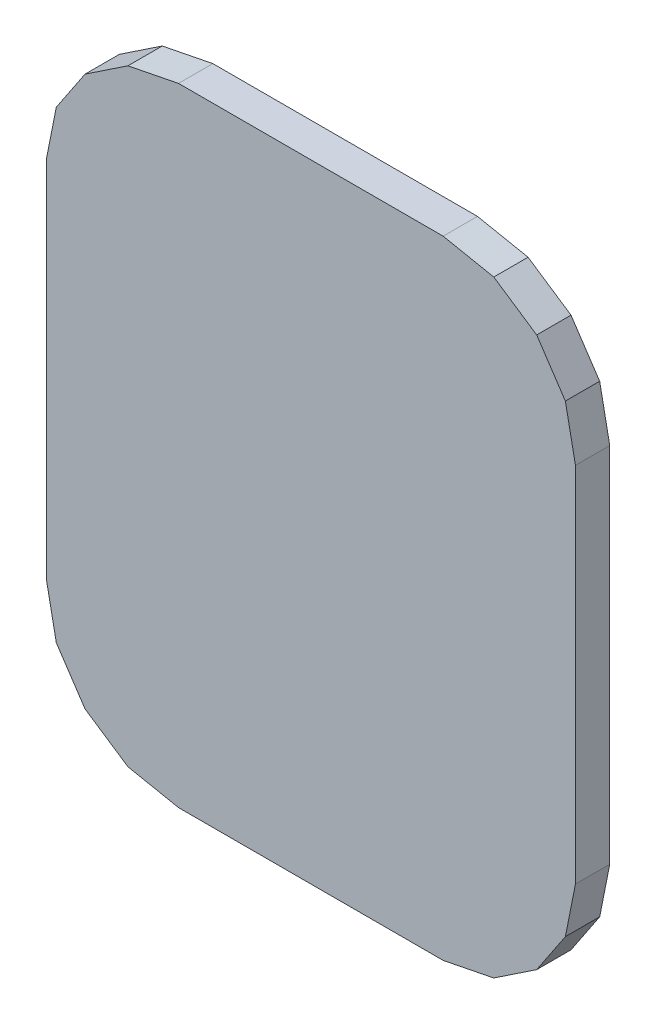
ISO-10303-21;
HEADER;
FILE_DESCRIPTION(('STEP AP214'),'2;1');
FILE_NAME('part.step','',(''),(''),'','','');
FILE_SCHEMA(('AUTOMOTIVE_DESIGN { 1 0 10303 214 1 1 1 1 }'));
ENDSEC;
DATA;
#1=APPLICATION_CONTEXT('core data for automotive mechanical design processes');
#2=APPLICATION_PROTOCOL_DEFINITION('international standard','automotive_design',2000,#1);
#3=PRODUCT_CONTEXT('',#1,'mechanical');
#4=PRODUCT('Part','Part','',(#3));
#5=PRODUCT_RELATED_PRODUCT_CATEGORY('part','',(#4));
#6=PRODUCT_DEFINITION_FORMATION('','',#4);
#7=PRODUCT_DEFINITION_CONTEXT('part definition',#1,'design');
#8=PRODUCT_DEFINITION('design','',#6,#7);
#9=PRODUCT_DEFINITION_SHAPE('','',#8);
#10=(LENGTH_UNIT() NAMED_UNIT(*) SI_UNIT(.MILLI.,.METRE.));
#11=(NAMED_UNIT(*) PLANE_ANGLE_UNIT() SI_UNIT($,.RADIAN.));
#12=(NAMED_UNIT(*) SI_UNIT($,.STERADIAN.) SOLID_ANGLE_UNIT());
#13=UNCERTAINTY_MEASURE_WITH_UNIT(LENGTH_MEASURE(1.E-05),#10,'distance_accuracy_value','');
#14=(GEOMETRIC_REPRESENTATION_CONTEXT(3) GLOBAL_UNCERTAINTY_ASSIGNED_CONTEXT((#13)) GLOBAL_UNIT_ASSIGNED_CONTEXT((#10,
#11,#12)) REPRESENTATION_CONTEXT('',''));
#15=CARTESIAN_POINT('',(0.,0.,0.));
#16=DIRECTION('',(0.,0.,1.));
#17=DIRECTION('',(1.,0.,0.));
#18=AXIS2_PLACEMENT_3D('',#15,#16,#17);
#19=CARTESIAN_POINT('',(95.61,-122.5,1.635));
#20=DIRECTION('',(0.,0.,-1.));
#21=DIRECTION('',(0.,-1.,0.));
#22=AXIS2_PLACEMENT_3D('',#19,#20,#21);
#23=PLANE('',#22);
#24=DIRECTION('',(0.980786045861535,-0.195086473757908,0.));
#25=VECTOR('',#24,1.);
#26=CARTESIAN_POINT('',(95.745,-122.18,1.635));
#27=LINE('',#26,#25);
#28=CARTESIAN_POINT('',(95.745,-122.18,1.635));
#29=VERTEX_POINT('',#28);
#30=CARTESIAN_POINT('',(95.796662,-122.190276,1.635));
#31=VERTEX_POINT('',#30);
#32=EDGE_CURVE('E25',#29,#31,#27,.T.);
#33=ORIENTED_EDGE('',*,*,#32,.F.);
#34=DIRECTION('',(1.,0.,0.));
#35=VECTOR('',#34,1.);
#36=CARTESIAN_POINT('',(95.475,-122.18,1.635));
#37=LINE('',#36,#35);
#38=CARTESIAN_POINT('',(95.475,-122.18,1.635));
#39=VERTEX_POINT('',#38);
#40=EDGE_CURVE('E306',#39,#29,#37,.T.);
#41=ORIENTED_EDGE('',*,*,#40,.F.);
#42=DIRECTION('',(0.980786045861535,0.195086473757908,0.));
#43=VECTOR('',#42,1.);
#44=CARTESIAN_POINT('',(95.423338,-122.190276,1.635));
#45=LINE('',#44,#43);
#46=CARTESIAN_POINT('',(95.423338,-122.190276,1.635));
#47=VERTEX_POINT('',#46);
#48=EDGE_CURVE('E374',#47,#39,#45,.T.);
#49=ORIENTED_EDGE('',*,*,#48,.F.);
#50=DIRECTION('',(0.831462770177597,0.555580472846731,0.));
#51=VECTOR('',#50,1.);
#52=CARTESIAN_POINT('',(95.379541,-122.219541,1.635));
#53=LINE('',#52,#51);
#54=CARTESIAN_POINT('',(95.379541,-122.219541,1.635));
#55=VERTEX_POINT('',#54);
#56=EDGE_CURVE('E308',#55,#47,#53,.T.);
#57=ORIENTED_EDGE('',*,*,#56,.F.);
#58=DIRECTION('',(0.555580472846731,0.831462770177597,0.));
#59=VECTOR('',#58,1.);
#60=CARTESIAN_POINT('',(95.350276,-122.263338,1.635));
#61=LINE('',#60,#59);
#62=CARTESIAN_POINT('',(95.350276,-122.263338,1.635));
#63=VERTEX_POINT('',#62);
#64=EDGE_CURVE('E252',#63,#55,#61,.T.);
#65=ORIENTED_EDGE('',*,*,#64,.F.);
#66=DIRECTION('',(0.195086473757908,0.980786045861535,0.));
#67=VECTOR('',#66,1.);
#68=CARTESIAN_POINT('',(95.34,-122.315,1.635));
#69=LINE('',#68,#67);
#70=CARTESIAN_POINT('',(95.34,-122.315,1.635));
#71=VERTEX_POINT('',#70);
#72=EDGE_CURVE('E382',#71,#63,#69,.T.);
#73=ORIENTED_EDGE('',*,*,#72,.F.);
#74=DIRECTION('',(0.,1.,0.));
#75=VECTOR('',#74,1.);
#76=CARTESIAN_POINT('',(95.34,-122.685,1.635));
#77=LINE('',#76,#75);
#78=CARTESIAN_POINT('',(95.34,-122.685,1.635));
#79=VERTEX_POINT('',#78);
#80=EDGE_CURVE('E314',#79,#71,#77,.T.);
#81=ORIENTED_EDGE('',*,*,#80,.F.);
#82=DIRECTION('',(-0.195086473757908,0.980786045861535,0.));
#83=VECTOR('',#82,1.);
#84=CARTESIAN_POINT('',(95.350276,-122.736662,1.635));
#85=LINE('',#84,#83);
#86=CARTESIAN_POINT('',(95.350276,-122.736662,1.635));
#87=VERTEX_POINT('',#86);
#88=EDGE_CURVE('E356',#87,#79,#85,.T.);
#89=ORIENTED_EDGE('',*,*,#88,.F.);
#90=DIRECTION('',(-0.555580472846731,0.831462770177597,0.));
#91=VECTOR('',#90,1.);
#92=CARTESIAN_POINT('',(95.379541,-122.780459,1.635));
#93=LINE('',#92,#91);
#94=CARTESIAN_POINT('',(95.379541,-122.780459,1.635));
#95=VERTEX_POINT('',#94);
#96=EDGE_CURVE('E291',#95,#87,#93,.T.);
#97=ORIENTED_EDGE('',*,*,#96,.F.);
#98=DIRECTION('',(-0.831462770177597,0.555580472846731,0.));
#99=VECTOR('',#98,1.);
#100=CARTESIAN_POINT('',(95.423338,-122.809724,1.635));
#101=LINE('',#100,#99);
#102=CARTESIAN_POINT('',(95.423338,-122.809724,1.635));
#103=VERTEX_POINT('',#102);
#104=EDGE_CURVE('E348',#103,#95,#101,.T.);
#105=ORIENTED_EDGE('',*,*,#104,.F.);
#106=DIRECTION('',(-0.980786045861535,0.195086473757908,0.));
#107=VECTOR('',#106,1.);
#108=CARTESIAN_POINT('',(95.475,-122.82,1.635));
#109=LINE('',#108,#107);
#110=CARTESIAN_POINT('',(95.475,-122.82,1.635));
#111=VERTEX_POINT('',#110);
#112=EDGE_CURVE('E335',#111,#103,#109,.T.);
#113=ORIENTED_EDGE('',*,*,#112,.F.);
#114=DIRECTION('',(-1.,0.,0.));
#115=VECTOR('',#114,1.);
#116=CARTESIAN_POINT('',(95.745,-122.82,1.635));
#117=LINE('',#116,#115);
#118=CARTESIAN_POINT('',(95.745,-122.82,1.635));
#119=VERTEX_POINT('',#118);
#120=EDGE_CURVE('E323',#119,#111,#117,.T.);
#121=ORIENTED_EDGE('',*,*,#120,.F.);
#122=DIRECTION('',(-0.980786045861535,-0.195086473757908,0.));
#123=VECTOR('',#122,1.);
#124=CARTESIAN_POINT('',(95.796662,-122.809724,1.635));
#125=LINE('',#124,#123);
#126=CARTESIAN_POINT('',(95.796662,-122.809724,1.635));
#127=VERTEX_POINT('',#126);
#128=EDGE_CURVE('E272',#127,#119,#125,.T.);
#129=ORIENTED_EDGE('',*,*,#128,.F.);
#130=DIRECTION('',(-0.831462770177597,-0.555580472846731,0.));
#131=VECTOR('',#130,1.);
#132=CARTESIAN_POINT('',(95.840459,-122.780459,1.635));
#133=LINE('',#132,#131);
#134=CARTESIAN_POINT('',(95.840459,-122.780459,1.635));
#135=VERTEX_POINT('',#134);
#136=EDGE_CURVE('E281',#135,#127,#133,.T.);
#137=ORIENTED_EDGE('',*,*,#136,.F.);
#138=DIRECTION('',(-0.555580472846731,-0.831462770177597,0.));
#139=VECTOR('',#138,1.);
#140=CARTESIAN_POINT('',(95.869724,-122.736662,1.635));
#141=LINE('',#140,#139);
#142=CARTESIAN_POINT('',(95.869724,-122.736662,1.635));
#143=VERTEX_POINT('',#142);
#144=EDGE_CURVE('E263',#143,#135,#141,.T.);
#145=ORIENTED_EDGE('',*,*,#144,.F.);
#146=DIRECTION('',(-0.195086473757908,-0.980786045861535,0.));
#147=VECTOR('',#146,1.);
#148=CARTESIAN_POINT('',(95.88,-122.685,1.635));
#149=LINE('',#148,#147);
#150=CARTESIAN_POINT('',(95.88,-122.685,1.635));
#151=VERTEX_POINT('',#150);
#152=EDGE_CURVE('E237',#151,#143,#149,.T.);
#153=ORIENTED_EDGE('',*,*,#152,.F.);
#154=DIRECTION('',(0.,-1.,0.));
#155=VECTOR('',#154,1.);
#156=CARTESIAN_POINT('',(95.88,-122.315,1.635));
#157=LINE('',#156,#155);
#158=CARTESIAN_POINT('',(95.88,-122.315,1.635));
#159=VERTEX_POINT('',#158);
#160=EDGE_CURVE('E201',#159,#151,#157,.T.);
#161=ORIENTED_EDGE('',*,*,#160,.F.);
#162=DIRECTION('',(0.195086473757908,-0.980786045861535,0.));
#163=VECTOR('',#162,1.);
#164=CARTESIAN_POINT('',(95.869724,-122.263338,1.635));
#165=LINE('',#164,#163);
#166=CARTESIAN_POINT('',(95.869724,-122.263338,1.635));
#167=VERTEX_POINT('',#166);
#168=EDGE_CURVE('E195',#167,#159,#165,.T.);
#169=ORIENTED_EDGE('',*,*,#168,.F.);
#170=DIRECTION('',(0.555580472846731,-0.831462770177597,0.));
#171=VECTOR('',#170,1.);
#172=CARTESIAN_POINT('',(95.840459,-122.219541,1.635));
#173=LINE('',#172,#171);
#174=CARTESIAN_POINT('',(95.840459,-122.219541,1.635));
#175=VERTEX_POINT('',#174);
#176=EDGE_CURVE('E198',#175,#167,#173,.T.);
#177=ORIENTED_EDGE('',*,*,#176,.F.);
#178=DIRECTION('',(0.831462770177597,-0.555580472846731,0.));
#179=VECTOR('',#178,1.);
#180=CARTESIAN_POINT('',(95.796662,-122.190276,1.635));
#181=LINE('',#180,#179);
#182=EDGE_CURVE('E424',#31,#175,#181,.T.);
#183=ORIENTED_EDGE('',*,*,#182,.F.);
#184=EDGE_LOOP('',(#33,#41,#49,#57,#65,#73,#81,#89,#97,#105,#113,#121,#129,#137,#145,#153,#161,
#169,#177,#183));
#185=FACE_BOUND('',#184,.T.);
#186=ADVANCED_FACE('F17',(#185),#23,.F.);
#187=CARTESIAN_POINT('',(95.61,-122.5,1.6));
#188=DIRECTION('',(0.,0.,-1.));
#189=DIRECTION('',(0.,-1.,0.));
#190=AXIS2_PLACEMENT_3D('',#187,#188,#189);
#191=PLANE('',#190);
#192=DIRECTION('',(0.831462770177597,-0.555580472846731,0.));
#193=VECTOR('',#192,1.);
#194=CARTESIAN_POINT('',(95.796662,-122.190276,1.6));
#195=LINE('',#194,#193);
#196=CARTESIAN_POINT('',(95.796662,-122.190276,1.6));
#197=VERTEX_POINT('',#196);
#198=CARTESIAN_POINT('',(95.840459,-122.219541,1.6));
#199=VERTEX_POINT('',#198);
#200=EDGE_CURVE('E223',#197,#199,#195,.T.);
#201=ORIENTED_EDGE('',*,*,#200,.T.);
#202=DIRECTION('',(0.555580472846731,-0.831462770177597,0.));
#203=VECTOR('',#202,1.);
#204=CARTESIAN_POINT('',(95.840459,-122.219541,1.6));
#205=LINE('',#204,#203);
#206=CARTESIAN_POINT('',(95.869724,-122.263338,1.6));
#207=VERTEX_POINT('',#206);
#208=EDGE_CURVE('E207',#199,#207,#205,.T.);
#209=ORIENTED_EDGE('',*,*,#208,.T.);
#210=DIRECTION('',(0.195086473757908,-0.980786045861535,0.));
#211=VECTOR('',#210,1.);
#212=CARTESIAN_POINT('',(95.869724,-122.263338,1.6));
#213=LINE('',#212,#211);
#214=CARTESIAN_POINT('',(95.88,-122.315,1.6));
#215=VERTEX_POINT('',#214);
#216=EDGE_CURVE('E213',#207,#215,#213,.T.);
#217=ORIENTED_EDGE('',*,*,#216,.T.);
#218=DIRECTION('',(0.,-1.,0.));
#219=VECTOR('',#218,1.);
#220=CARTESIAN_POINT('',(95.88,-122.315,1.6));
#221=LINE('',#220,#219);
#222=CARTESIAN_POINT('',(95.88,-122.685,1.6));
#223=VERTEX_POINT('',#222);
#224=EDGE_CURVE('E242',#215,#223,#221,.T.);
#225=ORIENTED_EDGE('',*,*,#224,.T.);
#226=DIRECTION('',(-0.195086473757908,-0.980786045861535,0.));
#227=VECTOR('',#226,1.);
#228=CARTESIAN_POINT('',(95.88,-122.685,1.6));
#229=LINE('',#228,#227);
#230=CARTESIAN_POINT('',(95.869724,-122.736662,1.6));
#231=VERTEX_POINT('',#230);
#232=EDGE_CURVE('E262',#223,#231,#229,.T.);
#233=ORIENTED_EDGE('',*,*,#232,.T.);
#234=DIRECTION('',(-0.555580472846731,-0.831462770177597,0.));
#235=VECTOR('',#234,1.);
#236=CARTESIAN_POINT('',(95.869724,-122.736662,1.6));
#237=LINE('',#236,#235);
#238=CARTESIAN_POINT('',(95.840459,-122.780459,1.6));
#239=VERTEX_POINT('',#238);
#240=EDGE_CURVE('E271',#231,#239,#237,.T.);
#241=ORIENTED_EDGE('',*,*,#240,.T.);
#242=DIRECTION('',(-0.831462770177597,-0.555580472846731,0.));
#243=VECTOR('',#242,1.);
#244=CARTESIAN_POINT('',(95.840459,-122.780459,1.6));
#245=LINE('',#244,#243);
#246=CARTESIAN_POINT('',(95.796662,-122.809724,1.6));
#247=VERTEX_POINT('',#246);
#248=EDGE_CURVE('E277',#239,#247,#245,.T.);
#249=ORIENTED_EDGE('',*,*,#248,.T.);
#250=DIRECTION('',(-0.980786045861535,-0.195086473757908,0.));
#251=VECTOR('',#250,1.);
#252=CARTESIAN_POINT('',(95.796662,-122.809724,1.6));
#253=LINE('',#252,#251);
#254=CARTESIAN_POINT('',(95.745,-122.82,1.6));
#255=VERTEX_POINT('',#254);
#256=EDGE_CURVE('E301',#247,#255,#253,.T.);
#257=ORIENTED_EDGE('',*,*,#256,.T.);
#258=DIRECTION('',(-1.,0.,0.));
#259=VECTOR('',#258,1.);
#260=CARTESIAN_POINT('',(95.745,-122.82,1.6));
#261=LINE('',#260,#259);
#262=CARTESIAN_POINT('',(95.475,-122.82,1.6));
#263=VERTEX_POINT('',#262);
#264=EDGE_CURVE('E331',#255,#263,#261,.T.);
#265=ORIENTED_EDGE('',*,*,#264,.T.);
#266=DIRECTION('',(-0.980786045861535,0.195086473757908,0.));
#267=VECTOR('',#266,1.);
#268=CARTESIAN_POINT('',(95.475,-122.82,1.6));
#269=LINE('',#268,#267);
#270=CARTESIAN_POINT('',(95.423338,-122.809724,1.6));
#271=VERTEX_POINT('',#270);
#272=EDGE_CURVE('E344',#263,#271,#269,.T.);
#273=ORIENTED_EDGE('',*,*,#272,.T.);
#274=DIRECTION('',(-0.831462770177597,0.555580472846731,0.));
#275=VECTOR('',#274,1.);
#276=CARTESIAN_POINT('',(95.423338,-122.809724,1.6));
#277=LINE('',#276,#275);
#278=CARTESIAN_POINT('',(95.379541,-122.780459,1.6));
#279=VERTEX_POINT('',#278);
#280=EDGE_CURVE('E343',#271,#279,#277,.T.);
#281=ORIENTED_EDGE('',*,*,#280,.T.);
#282=DIRECTION('',(-0.555580472846731,0.831462770177597,0.));
#283=VECTOR('',#282,1.);
#284=CARTESIAN_POINT('',(95.379541,-122.780459,1.6));
#285=LINE('',#284,#283);
#286=CARTESIAN_POINT('',(95.350276,-122.736662,1.6));
#287=VERTEX_POINT('',#286);
#288=EDGE_CURVE('E290',#279,#287,#285,.T.);
#289=ORIENTED_EDGE('',*,*,#288,.T.);
#290=DIRECTION('',(-0.195086473757908,0.980786045861535,0.));
#291=VECTOR('',#290,1.);
#292=CARTESIAN_POINT('',(95.350276,-122.736662,1.6));
#293=LINE('',#292,#291);
#294=CARTESIAN_POINT('',(95.34,-122.685,1.6));
#295=VERTEX_POINT('',#294);
#296=EDGE_CURVE('E319',#287,#295,#293,.T.);
#297=ORIENTED_EDGE('',*,*,#296,.T.);
#298=DIRECTION('',(0.,1.,0.));
#299=VECTOR('',#298,1.);
#300=CARTESIAN_POINT('',(95.34,-122.685,1.6));
#301=LINE('',#300,#299);
#302=CARTESIAN_POINT('',(95.34,-122.315,1.6));
#303=VERTEX_POINT('',#302);
#304=EDGE_CURVE('E378',#295,#303,#301,.T.);
#305=ORIENTED_EDGE('',*,*,#304,.T.);
#306=DIRECTION('',(0.195086473757908,0.980786045861535,0.));
#307=VECTOR('',#306,1.);
#308=CARTESIAN_POINT('',(95.34,-122.315,1.6));
#309=LINE('',#308,#307);
#310=CARTESIAN_POINT('',(95.350276,-122.263338,1.6));
#311=VERTEX_POINT('',#310);
#312=EDGE_CURVE('E248',#303,#311,#309,.T.);
#313=ORIENTED_EDGE('',*,*,#312,.T.);
#314=DIRECTION('',(0.555580472846731,0.831462770177597,0.));
#315=VECTOR('',#314,1.);
#316=CARTESIAN_POINT('',(95.350276,-122.263338,1.6));
#317=LINE('',#316,#315);
#318=CARTESIAN_POINT('',(95.379541,-122.219541,1.6));
#319=VERTEX_POINT('',#318);
#320=EDGE_CURVE('E313',#311,#319,#317,.T.);
#321=ORIENTED_EDGE('',*,*,#320,.T.);
#322=DIRECTION('',(0.831462770177597,0.555580472846731,0.));
#323=VECTOR('',#322,1.);
#324=CARTESIAN_POINT('',(95.379541,-122.219541,1.6));
#325=LINE('',#324,#323);
#326=CARTESIAN_POINT('',(95.423338,-122.190276,1.6));
#327=VERTEX_POINT('',#326);
#328=EDGE_CURVE('E360',#319,#327,#325,.T.);
#329=ORIENTED_EDGE('',*,*,#328,.T.);
#330=DIRECTION('',(0.980786045861535,0.195086473757908,0.));
#331=VECTOR('',#330,1.);
#332=CARTESIAN_POINT('',(95.423338,-122.190276,1.6));
#333=LINE('',#332,#331);
#334=CARTESIAN_POINT('',(95.475,-122.18,1.6));
#335=VERTEX_POINT('',#334);
#336=EDGE_CURVE('E302',#327,#335,#333,.T.);
#337=ORIENTED_EDGE('',*,*,#336,.T.);
#338=DIRECTION('',(1.,0.,0.));
#339=VECTOR('',#338,1.);
#340=CARTESIAN_POINT('',(95.475,-122.18,1.6));
#341=LINE('',#340,#339);
#342=CARTESIAN_POINT('',(95.745,-122.18,1.6));
#343=VERTEX_POINT('',#342);
#344=EDGE_CURVE('E258',#335,#343,#341,.T.);
#345=ORIENTED_EDGE('',*,*,#344,.T.);
#346=DIRECTION('',(0.980786045861535,-0.195086473757908,0.));
#347=VECTOR('',#346,1.);
#348=CARTESIAN_POINT('',(95.745,-122.18,1.6));
#349=LINE('',#348,#347);
#350=EDGE_CURVE('E11',#343,#197,#349,.T.);
#351=ORIENTED_EDGE('',*,*,#350,.T.);
#352=EDGE_LOOP('',(#201,#209,#217,#225,#233,#241,#249,#257,#265,#273,#281,#289,#297,#305,#313,
#321,#329,#337,#345,#351));
#353=FACE_BOUND('',#352,.T.);
#354=ADVANCED_FACE('F441',(#353),#191,.T.);
#355=CARTESIAN_POINT('',(95.745,-122.18,1.6));
#356=DIRECTION('',(0.195086473757908,0.980786045861535,0.));
#357=DIRECTION('',(0.,0.,-1.));
#358=AXIS2_PLACEMENT_3D('',#355,#356,#357);
#359=PLANE('',#358);
#360=DIRECTION('',(0.,0.,1.));
#361=VECTOR('',#360,1.);
#362=CARTESIAN_POINT('',(95.745,-122.18,1.6));
#363=LINE('',#362,#361);
#364=EDGE_CURVE('E397',#343,#29,#363,.T.);
#365=ORIENTED_EDGE('',*,*,#364,.T.);
#366=ORIENTED_EDGE('',*,*,#32,.T.);
#367=DIRECTION('',(0.,0.,1.));
#368=VECTOR('',#367,1.);
#369=CARTESIAN_POINT('',(95.796662,-122.190276,1.6));
#370=LINE('',#369,#368);
#371=EDGE_CURVE('E420',#197,#31,#370,.T.);
#372=ORIENTED_EDGE('',*,*,#371,.F.);
#373=ORIENTED_EDGE('',*,*,#350,.F.);
#374=EDGE_LOOP('',(#365,#366,#372,#373));
#375=FACE_BOUND('',#374,.T.);
#376=ADVANCED_FACE('F586',(#375),#359,.T.);
#377=CARTESIAN_POINT('',(95.475,-122.18,1.6));
#378=DIRECTION('',(0.,1.,0.));
#379=DIRECTION('',(1.,0.,0.));
#380=AXIS2_PLACEMENT_3D('',#377,#378,#379);
#381=PLANE('',#380);
#382=DIRECTION('',(0.,0.,1.));
#383=VECTOR('',#382,1.);
#384=CARTESIAN_POINT('',(95.475,-122.18,1.6));
#385=LINE('',#384,#383);
#386=EDGE_CURVE('E307',#335,#39,#385,.T.);
#387=ORIENTED_EDGE('',*,*,#386,.T.);
#388=ORIENTED_EDGE('',*,*,#40,.T.);
#389=ORIENTED_EDGE('',*,*,#364,.F.);
#390=ORIENTED_EDGE('',*,*,#344,.F.);
#391=EDGE_LOOP('',(#387,#388,#389,#390));
#392=FACE_BOUND('',#391,.T.);
#393=ADVANCED_FACE('F580',(#392),#381,.T.);
#394=CARTESIAN_POINT('',(95.423338,-122.190276,1.6));
#395=DIRECTION('',(-0.195086473757908,0.980786045861535,0.));
#396=DIRECTION('',(0.,0.,1.));
#397=AXIS2_PLACEMENT_3D('',#394,#395,#396);
#398=PLANE('',#397);
#399=DIRECTION('',(0.,0.,1.));
#400=VECTOR('',#399,1.);
#401=CARTESIAN_POINT('',(95.423338,-122.190276,1.6));
#402=LINE('',#401,#400);
#403=EDGE_CURVE('E312',#327,#47,#402,.T.);
#404=ORIENTED_EDGE('',*,*,#403,.T.);
#405=ORIENTED_EDGE('',*,*,#48,.T.);
#406=ORIENTED_EDGE('',*,*,#386,.F.);
#407=ORIENTED_EDGE('',*,*,#336,.F.);
#408=EDGE_LOOP('',(#404,#405,#406,#407));
#409=FACE_BOUND('',#408,.T.);
#410=ADVANCED_FACE('F585',(#409),#398,.T.);
#411=CARTESIAN_POINT('',(95.379541,-122.219541,1.6));
#412=DIRECTION('',(-0.555580472846731,0.831462770177597,0.));
#413=DIRECTION('',(0.,0.,1.));
#414=AXIS2_PLACEMENT_3D('',#411,#412,#413);
#415=PLANE('',#414);
#416=DIRECTION('',(0.,0.,1.));
#417=VECTOR('',#416,1.);
#418=CARTESIAN_POINT('',(95.379541,-122.219541,1.6));
#419=LINE('',#418,#417);
#420=EDGE_CURVE('E233',#319,#55,#419,.T.);
#421=ORIENTED_EDGE('',*,*,#420,.T.);
#422=ORIENTED_EDGE('',*,*,#56,.T.);
#423=ORIENTED_EDGE('',*,*,#403,.F.);
#424=ORIENTED_EDGE('',*,*,#328,.F.);
#425=EDGE_LOOP('',(#421,#422,#423,#424));
#426=FACE_BOUND('',#425,.T.);
#427=ADVANCED_FACE('F649',(#426),#415,.T.);
#428=CARTESIAN_POINT('',(95.350276,-122.263338,1.6));
#429=DIRECTION('',(-0.831462770177597,0.555580472846731,0.));
#430=DIRECTION('',(0.,0.,1.));
#431=AXIS2_PLACEMENT_3D('',#428,#429,#430);
#432=PLANE('',#431);
#433=DIRECTION('',(0.,0.,1.));
#434=VECTOR('',#433,1.);
#435=CARTESIAN_POINT('',(95.350276,-122.263338,1.6));
#436=LINE('',#435,#434);
#437=EDGE_CURVE('E253',#311,#63,#436,.T.);
#438=ORIENTED_EDGE('',*,*,#437,.T.);
#439=ORIENTED_EDGE('',*,*,#64,.T.);
#440=ORIENTED_EDGE('',*,*,#420,.F.);
#441=ORIENTED_EDGE('',*,*,#320,.F.);
#442=EDGE_LOOP('',(#438,#439,#440,#441));
#443=FACE_BOUND('',#442,.T.);
#444=ADVANCED_FACE('F643',(#443),#432,.T.);
#445=CARTESIAN_POINT('',(95.34,-122.315,1.6));
#446=DIRECTION('',(-0.980786045861535,0.195086473757908,0.));
#447=DIRECTION('',(0.,0.,1.));
#448=AXIS2_PLACEMENT_3D('',#445,#446,#447);
#449=PLANE('',#448);
#450=DIRECTION('',(0.,0.,1.));
#451=VECTOR('',#450,1.);
#452=CARTESIAN_POINT('',(95.34,-122.315,1.6));
#453=LINE('',#452,#451);
#454=EDGE_CURVE('E318',#303,#71,#453,.T.);
#455=ORIENTED_EDGE('',*,*,#454,.T.);
#456=ORIENTED_EDGE('',*,*,#72,.T.);
#457=ORIENTED_EDGE('',*,*,#437,.F.);
#458=ORIENTED_EDGE('',*,*,#312,.F.);
#459=EDGE_LOOP('',(#455,#456,#457,#458));
#460=FACE_BOUND('',#459,.T.);
#461=ADVANCED_FACE('F648',(#460),#449,.T.);
#462=CARTESIAN_POINT('',(95.34,-122.685,1.6));
#463=DIRECTION('',(-1.,0.,0.));
#464=DIRECTION('',(0.,0.,1.));
#465=AXIS2_PLACEMENT_3D('',#462,#463,#464);
#466=PLANE('',#465);
#467=DIRECTION('',(0.,0.,1.));
#468=VECTOR('',#467,1.);
#469=CARTESIAN_POINT('',(95.34,-122.685,1.6));
#470=LINE('',#469,#468);
#471=EDGE_CURVE('E364',#295,#79,#470,.T.);
#472=ORIENTED_EDGE('',*,*,#471,.T.);
#473=ORIENTED_EDGE('',*,*,#80,.T.);
#474=ORIENTED_EDGE('',*,*,#454,.F.);
#475=ORIENTED_EDGE('',*,*,#304,.F.);
#476=EDGE_LOOP('',(#472,#473,#474,#475));
#477=FACE_BOUND('',#476,.T.);
#478=ADVANCED_FACE('F667',(#477),#466,.T.);
#479=CARTESIAN_POINT('',(95.350276,-122.736662,1.6));
#480=DIRECTION('',(-0.980786045861535,-0.195086473757908,0.));
#481=DIRECTION('',(-0.195086473757908,0.980786045861535,0.));
#482=AXIS2_PLACEMENT_3D('',#479,#480,#481);
#483=PLANE('',#482);
#484=DIRECTION('',(0.,0.,1.));
#485=VECTOR('',#484,1.);
#486=CARTESIAN_POINT('',(95.350276,-122.736662,1.6));
#487=LINE('',#486,#485);
#488=EDGE_CURVE('E286',#287,#87,#487,.T.);
#489=ORIENTED_EDGE('',*,*,#488,.T.);
#490=ORIENTED_EDGE('',*,*,#88,.T.);
#491=ORIENTED_EDGE('',*,*,#471,.F.);
#492=ORIENTED_EDGE('',*,*,#296,.F.);
#493=EDGE_LOOP('',(#489,#490,#491,#492));
#494=FACE_BOUND('',#493,.T.);
#495=ADVANCED_FACE('F672',(#494),#483,.T.);
#496=CARTESIAN_POINT('',(95.379541,-122.780459,1.6));
#497=DIRECTION('',(-0.831462770177597,-0.555580472846731,0.));
#498=DIRECTION('',(-0.555580472846731,0.831462770177597,0.));
#499=AXIS2_PLACEMENT_3D('',#496,#497,#498);
#500=PLANE('',#499);
#501=DIRECTION('',(0.,0.,1.));
#502=VECTOR('',#501,1.);
#503=CARTESIAN_POINT('',(95.379541,-122.780459,1.6));
#504=LINE('',#503,#502);
#505=EDGE_CURVE('E352',#279,#95,#504,.T.);
#506=ORIENTED_EDGE('',*,*,#505,.T.);
#507=ORIENTED_EDGE('',*,*,#96,.T.);
#508=ORIENTED_EDGE('',*,*,#488,.F.);
#509=ORIENTED_EDGE('',*,*,#288,.F.);
#510=EDGE_LOOP('',(#506,#507,#508,#509));
#511=FACE_BOUND('',#510,.T.);
#512=ADVANCED_FACE('F661',(#511),#500,.T.);
#513=CARTESIAN_POINT('',(95.423338,-122.809724,1.6));
#514=DIRECTION('',(-0.555580472846731,-0.831462770177597,0.));
#515=DIRECTION('',(-0.831462770177597,0.555580472846731,0.));
#516=AXIS2_PLACEMENT_3D('',#513,#514,#515);
#517=PLANE('',#516);
#518=DIRECTION('',(0.,0.,1.));
#519=VECTOR('',#518,1.);
#520=CARTESIAN_POINT('',(95.423338,-122.809724,1.6));
#521=LINE('',#520,#519);
#522=EDGE_CURVE('E339',#271,#103,#521,.T.);
#523=ORIENTED_EDGE('',*,*,#522,.T.);
#524=ORIENTED_EDGE('',*,*,#104,.T.);
#525=ORIENTED_EDGE('',*,*,#505,.F.);
#526=ORIENTED_EDGE('',*,*,#280,.F.);
#527=EDGE_LOOP('',(#523,#524,#525,#526));
#528=FACE_BOUND('',#527,.T.);
#529=ADVANCED_FACE('F656',(#528),#517,.T.);
#530=CARTESIAN_POINT('',(95.475,-122.82,1.6));
#531=DIRECTION('',(-0.195086473757908,-0.980786045861535,0.));
#532=DIRECTION('',(-0.980786045861535,0.195086473757908,0.));
#533=AXIS2_PLACEMENT_3D('',#530,#531,#532);
#534=PLANE('',#533);
#535=DIRECTION('',(0.,0.,1.));
#536=VECTOR('',#535,1.);
#537=CARTESIAN_POINT('',(95.475,-122.82,1.6));
#538=LINE('',#537,#536);
#539=EDGE_CURVE('E327',#263,#111,#538,.T.);
#540=ORIENTED_EDGE('',*,*,#539,.T.);
#541=ORIENTED_EDGE('',*,*,#112,.T.);
#542=ORIENTED_EDGE('',*,*,#522,.F.);
#543=ORIENTED_EDGE('',*,*,#272,.F.);
#544=EDGE_LOOP('',(#540,#541,#542,#543));
#545=FACE_BOUND('',#544,.T.);
#546=ADVANCED_FACE('F607',(#545),#534,.T.);
#547=CARTESIAN_POINT('',(95.745,-122.82,1.6));
#548=DIRECTION('',(0.,-1.,0.));
#549=DIRECTION('',(0.,0.,-1.));
#550=AXIS2_PLACEMENT_3D('',#547,#548,#549);
#551=PLANE('',#550);
#552=DIRECTION('',(0.,0.,1.));
#553=VECTOR('',#552,1.);
#554=CARTESIAN_POINT('',(95.745,-122.82,1.6));
#555=LINE('',#554,#553);
#556=EDGE_CURVE('E276',#255,#119,#555,.T.);
#557=ORIENTED_EDGE('',*,*,#556,.T.);
#558=ORIENTED_EDGE('',*,*,#120,.T.);
#559=ORIENTED_EDGE('',*,*,#539,.F.);
#560=ORIENTED_EDGE('',*,*,#264,.F.);
#561=EDGE_LOOP('',(#557,#558,#559,#560));
#562=FACE_BOUND('',#561,.T.);
#563=ADVANCED_FACE('F601',(#562),#551,.T.);
#564=CARTESIAN_POINT('',(95.796662,-122.809724,1.6));
#565=DIRECTION('',(0.195086473757908,-0.980786045861535,0.));
#566=DIRECTION('',(0.,0.,-1.));
#567=AXIS2_PLACEMENT_3D('',#564,#565,#566);
#568=PLANE('',#567);
#569=DIRECTION('',(0.,0.,1.));
#570=VECTOR('',#569,1.);
#571=CARTESIAN_POINT('',(95.796662,-122.809724,1.6));
#572=LINE('',#571,#570);
#573=EDGE_CURVE('E285',#247,#127,#572,.T.);
#574=ORIENTED_EDGE('',*,*,#573,.T.);
#575=ORIENTED_EDGE('',*,*,#128,.T.);
#576=ORIENTED_EDGE('',*,*,#556,.F.);
#577=ORIENTED_EDGE('',*,*,#256,.F.);
#578=EDGE_LOOP('',(#574,#575,#576,#577));
#579=FACE_BOUND('',#578,.T.);
#580=ADVANCED_FACE('F606',(#579),#568,.T.);
#581=CARTESIAN_POINT('',(95.840459,-122.780459,1.6));
#582=DIRECTION('',(0.555580472846731,-0.831462770177597,0.));
#583=DIRECTION('',(0.,0.,-1.));
#584=AXIS2_PLACEMENT_3D('',#581,#582,#583);
#585=PLANE('',#584);
#586=DIRECTION('',(0.,0.,1.));
#587=VECTOR('',#586,1.);
#588=CARTESIAN_POINT('',(95.840459,-122.780459,1.6));
#589=LINE('',#588,#587);
#590=EDGE_CURVE('E267',#239,#135,#589,.T.);
#591=ORIENTED_EDGE('',*,*,#590,.T.);
#592=ORIENTED_EDGE('',*,*,#136,.T.);
#593=ORIENTED_EDGE('',*,*,#573,.F.);
#594=ORIENTED_EDGE('',*,*,#248,.F.);
#595=EDGE_LOOP('',(#591,#592,#593,#594));
#596=FACE_BOUND('',#595,.T.);
#597=ADVANCED_FACE('F681',(#596),#585,.T.);
#598=CARTESIAN_POINT('',(95.869724,-122.736662,1.6));
#599=DIRECTION('',(0.831462770177597,-0.555580472846731,0.));
#600=DIRECTION('',(0.,0.,-1.));
#601=AXIS2_PLACEMENT_3D('',#598,#599,#600);
#602=PLANE('',#601);
#603=DIRECTION('',(0.,0.,1.));
#604=VECTOR('',#603,1.);
#605=CARTESIAN_POINT('',(95.869724,-122.736662,1.6));
#606=LINE('',#605,#604);
#607=EDGE_CURVE('E241',#231,#143,#606,.T.);
#608=ORIENTED_EDGE('',*,*,#607,.T.);
#609=ORIENTED_EDGE('',*,*,#144,.T.);
#610=ORIENTED_EDGE('',*,*,#590,.F.);
#611=ORIENTED_EDGE('',*,*,#240,.F.);
#612=EDGE_LOOP('',(#608,#609,#610,#611));
#613=FACE_BOUND('',#612,.T.);
#614=ADVANCED_FACE('F638',(#613),#602,.T.);
#615=CARTESIAN_POINT('',(95.88,-122.685,1.6));
#616=DIRECTION('',(0.980786045861535,-0.195086473757908,0.));
#617=DIRECTION('',(0.,0.,-1.));
#618=AXIS2_PLACEMENT_3D('',#615,#616,#617);
#619=PLANE('',#618);
#620=DIRECTION('',(0.,0.,1.));
#621=VECTOR('',#620,1.);
#622=CARTESIAN_POINT('',(95.88,-122.685,1.6));
#623=LINE('',#622,#621);
#624=EDGE_CURVE('E235',#223,#151,#623,.T.);
#625=ORIENTED_EDGE('',*,*,#624,.T.);
#626=ORIENTED_EDGE('',*,*,#152,.T.);
#627=ORIENTED_EDGE('',*,*,#607,.F.);
#628=ORIENTED_EDGE('',*,*,#232,.F.);
#629=EDGE_LOOP('',(#625,#626,#627,#628));
#630=FACE_BOUND('',#629,.T.);
#631=ADVANCED_FACE('F446',(#630),#619,.T.);
#632=CARTESIAN_POINT('',(95.88,-122.315,1.6));
#633=DIRECTION('',(1.,0.,0.));
#634=DIRECTION('',(0.,1.,0.));
#635=AXIS2_PLACEMENT_3D('',#632,#633,#634);
#636=PLANE('',#635);
#637=DIRECTION('',(0.,0.,1.));
#638=VECTOR('',#637,1.);
#639=CARTESIAN_POINT('',(95.88,-122.315,1.6));
#640=LINE('',#639,#638);
#641=EDGE_CURVE('E206',#215,#159,#640,.T.);
#642=ORIENTED_EDGE('',*,*,#641,.T.);
#643=ORIENTED_EDGE('',*,*,#160,.T.);
#644=ORIENTED_EDGE('',*,*,#624,.F.);
#645=ORIENTED_EDGE('',*,*,#224,.F.);
#646=EDGE_LOOP('',(#642,#643,#644,#645));
#647=FACE_BOUND('',#646,.T.);
#648=ADVANCED_FACE('F444',(#647),#636,.T.);
#649=CARTESIAN_POINT('',(95.869724,-122.263338,1.6));
#650=DIRECTION('',(0.980786045861535,0.195086473757908,0.));
#651=DIRECTION('',(0.,0.,-1.));
#652=AXIS2_PLACEMENT_3D('',#649,#650,#651);
#653=PLANE('',#652);
#654=DIRECTION('',(0.,0.,1.));
#655=VECTOR('',#654,1.);
#656=CARTESIAN_POINT('',(95.869724,-122.263338,1.6));
#657=LINE('',#656,#655);
#658=EDGE_CURVE('E210',#207,#167,#657,.T.);
#659=ORIENTED_EDGE('',*,*,#658,.T.);
#660=ORIENTED_EDGE('',*,*,#168,.T.);
#661=ORIENTED_EDGE('',*,*,#641,.F.);
#662=ORIENTED_EDGE('',*,*,#216,.F.);
#663=EDGE_LOOP('',(#659,#660,#661,#662));
#664=FACE_BOUND('',#663,.T.);
#665=ADVANCED_FACE('F211',(#664),#653,.T.);
#666=CARTESIAN_POINT('',(95.840459,-122.219541,1.6));
#667=DIRECTION('',(0.831462770177597,0.555580472846731,0.));
#668=DIRECTION('',(0.,0.,-1.));
#669=AXIS2_PLACEMENT_3D('',#666,#667,#668);
#670=PLANE('',#669);
#671=DIRECTION('',(0.,0.,1.));
#672=VECTOR('',#671,1.);
#673=CARTESIAN_POINT('',(95.840459,-122.219541,1.6));
#674=LINE('',#673,#672);
#675=EDGE_CURVE('E220',#199,#175,#674,.T.);
#676=ORIENTED_EDGE('',*,*,#675,.T.);
#677=ORIENTED_EDGE('',*,*,#176,.T.);
#678=ORIENTED_EDGE('',*,*,#658,.F.);
#679=ORIENTED_EDGE('',*,*,#208,.F.);
#680=EDGE_LOOP('',(#676,#677,#678,#679));
#681=FACE_BOUND('',#680,.T.);
#682=ADVANCED_FACE('F218',(#681),#670,.T.);
#683=CARTESIAN_POINT('',(95.796662,-122.190276,1.6));
#684=DIRECTION('',(0.555580472846731,0.831462770177597,0.));
#685=DIRECTION('',(0.,0.,-1.));
#686=AXIS2_PLACEMENT_3D('',#683,#684,#685);
#687=PLANE('',#686);
#688=ORIENTED_EDGE('',*,*,#371,.T.);
#689=ORIENTED_EDGE('',*,*,#182,.T.);
#690=ORIENTED_EDGE('',*,*,#675,.F.);
#691=ORIENTED_EDGE('',*,*,#200,.F.);
#692=EDGE_LOOP('',(#688,#689,#690,#691));
#693=FACE_BOUND('',#692,.T.);
#694=ADVANCED_FACE('F592',(#693),#687,.T.);
#695=CLOSED_SHELL('',(#186,#354,#376,#393,#410,#427,#444,#461,#478,#495,#512,#529,#546,#563,
#580,#597,#614,#631,#648,#665,#682,#694));
#696=MANIFOLD_SOLID_BREP('B1',#695);
#697=ADVANCED_BREP_SHAPE_REPRESENTATION('',(#18,#696),#14);
#698=SHAPE_DEFINITION_REPRESENTATION(#9,#697);
ENDSEC;
END-ISO-10303-21;
